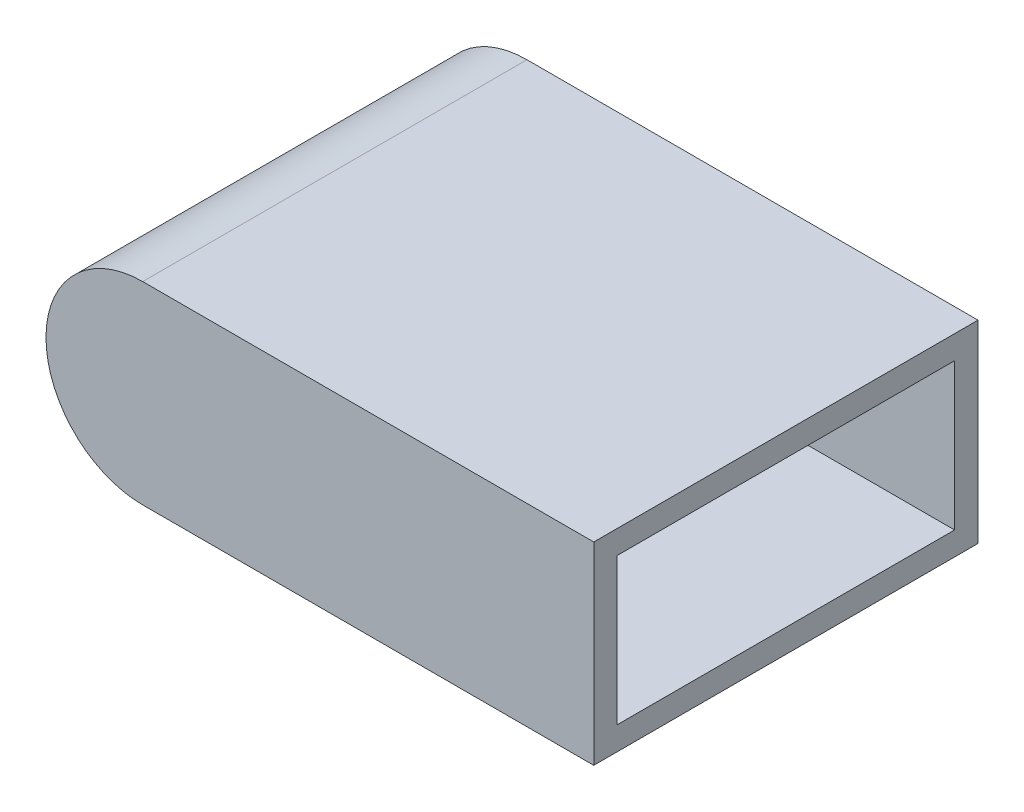
ISO-10303-21;
HEADER;
FILE_DESCRIPTION(('STEP AP214'),'2;1');
FILE_NAME('part.step','',(''),(''),'','','');
FILE_SCHEMA(('AUTOMOTIVE_DESIGN { 1 0 10303 214 1 1 1 1 }'));
ENDSEC;
DATA;
#1=APPLICATION_CONTEXT('core data for automotive mechanical design processes');
#2=APPLICATION_PROTOCOL_DEFINITION('international standard','automotive_design',2000,#1);
#3=PRODUCT_CONTEXT('',#1,'mechanical');
#4=PRODUCT('Part','Part','',(#3));
#5=PRODUCT_RELATED_PRODUCT_CATEGORY('part','',(#4));
#6=PRODUCT_DEFINITION_FORMATION('','',#4);
#7=PRODUCT_DEFINITION_CONTEXT('part definition',#1,'design');
#8=PRODUCT_DEFINITION('design','',#6,#7);
#9=PRODUCT_DEFINITION_SHAPE('','',#8);
#10=(LENGTH_UNIT() NAMED_UNIT(*) SI_UNIT(.MILLI.,.METRE.));
#11=(NAMED_UNIT(*) PLANE_ANGLE_UNIT() SI_UNIT($,.RADIAN.));
#12=(NAMED_UNIT(*) SI_UNIT($,.STERADIAN.) SOLID_ANGLE_UNIT());
#13=UNCERTAINTY_MEASURE_WITH_UNIT(LENGTH_MEASURE(1.E-05),#10,'distance_accuracy_value','');
#14=(GEOMETRIC_REPRESENTATION_CONTEXT(3) GLOBAL_UNCERTAINTY_ASSIGNED_CONTEXT((#13)) GLOBAL_UNIT_ASSIGNED_CONTEXT((#10,
#11,#12)) REPRESENTATION_CONTEXT('',''));
#15=CARTESIAN_POINT('',(0.,0.,0.));
#16=DIRECTION('',(0.,0.,1.));
#17=DIRECTION('',(1.,0.,0.));
#18=AXIS2_PLACEMENT_3D('',#15,#16,#17);
#19=CARTESIAN_POINT('',(18.2408360128618,22.3,22.15));
#20=DIRECTION('',(0.,0.,-1.));
#21=DIRECTION('',(-1.,0.,0.));
#22=AXIS2_PLACEMENT_3D('',#19,#20,#21);
#23=PLANE('',#22);
#24=DIRECTION('',(1.,0.,0.));
#25=VECTOR('',#24,1.);
#26=CARTESIAN_POINT('',(18.2408360128618,0.,22.15));
#27=LINE('',#26,#25);
#28=CARTESIAN_POINT('',(-33.7591639871383,0.,22.15));
#29=VERTEX_POINT('',#28);
#30=CARTESIAN_POINT('',(18.2408360128618,0.,22.15));
#31=VERTEX_POINT('',#30);
#32=EDGE_CURVE('E157',#29,#31,#27,.T.);
#33=ORIENTED_EDGE('',*,*,#32,.T.);
#34=DIRECTION('',(0.,-1.,0.));
#35=VECTOR('',#34,1.);
#36=CARTESIAN_POINT('',(18.2408360128618,22.3,22.15));
#37=LINE('',#36,#35);
#38=CARTESIAN_POINT('',(18.2408360128618,22.3,22.15));
#39=VERTEX_POINT('',#38);
#40=EDGE_CURVE('E11',#39,#31,#37,.T.);
#41=ORIENTED_EDGE('',*,*,#40,.F.);
#42=DIRECTION('',(1.,0.,0.));
#43=VECTOR('',#42,1.);
#44=CARTESIAN_POINT('',(18.2408360128618,22.3,22.15));
#45=LINE('',#44,#43);
#46=CARTESIAN_POINT('',(-33.7591639871383,22.3,22.15));
#47=VERTEX_POINT('',#46);
#48=EDGE_CURVE('E83',#47,#39,#45,.T.);
#49=ORIENTED_EDGE('',*,*,#48,.F.);
#50=CARTESIAN_POINT('',(-33.7591639871383,11.15,22.15));
#51=DIRECTION('',(0.,0.,1.));
#52=DIRECTION('',(1.,0.,0.));
#53=AXIS2_PLACEMENT_3D('',#50,#51,#52);
#54=CIRCLE('',#53,11.15);
#55=EDGE_CURVE('E117',#47,#29,#54,.T.);
#56=ORIENTED_EDGE('',*,*,#55,.T.);
#57=EDGE_LOOP('',(#33,#41,#49,#56));
#58=FACE_BOUND('',#57,.T.);
#59=ADVANCED_FACE('F33',(#58),#23,.F.);
#60=CARTESIAN_POINT('',(18.2408360128617,22.3,-22.15));
#61=DIRECTION('',(-1.,0.,0.));
#62=DIRECTION('',(0.,0.,1.));
#63=AXIS2_PLACEMENT_3D('',#60,#61,#62);
#64=PLANE('',#63);
#65=DIRECTION('',(0.,0.,1.));
#66=VECTOR('',#65,1.);
#67=CARTESIAN_POINT('',(18.2408360128618,19.6,19.45));
#68=LINE('',#67,#66);
#69=CARTESIAN_POINT('',(18.2408360128617,19.6,-19.45));
#70=VERTEX_POINT('',#69);
#71=CARTESIAN_POINT('',(18.2408360128618,19.6,19.45));
#72=VERTEX_POINT('',#71);
#73=EDGE_CURVE('E138',#70,#72,#68,.T.);
#74=ORIENTED_EDGE('',*,*,#73,.F.);
#75=DIRECTION('',(0.,1.,0.));
#76=VECTOR('',#75,1.);
#77=CARTESIAN_POINT('',(18.2408360128617,2.7,-19.45));
#78=LINE('',#77,#76);
#79=CARTESIAN_POINT('',(18.2408360128617,2.7,-19.45));
#80=VERTEX_POINT('',#79);
#81=EDGE_CURVE('E47',#80,#70,#78,.T.);
#82=ORIENTED_EDGE('',*,*,#81,.F.);
#83=DIRECTION('',(0.,0.,-1.));
#84=VECTOR('',#83,1.);
#85=CARTESIAN_POINT('',(18.2408360128618,2.7,19.45));
#86=LINE('',#85,#84);
#87=CARTESIAN_POINT('',(18.2408360128618,2.7,19.45));
#88=VERTEX_POINT('',#87);
#89=EDGE_CURVE('E128',#88,#80,#86,.T.);
#90=ORIENTED_EDGE('',*,*,#89,.F.);
#91=DIRECTION('',(0.,-1.,0.));
#92=VECTOR('',#91,1.);
#93=CARTESIAN_POINT('',(18.2408360128618,2.7,19.45));
#94=LINE('',#93,#92);
#95=EDGE_CURVE('E132',#72,#88,#94,.T.);
#96=ORIENTED_EDGE('',*,*,#95,.F.);
#97=EDGE_LOOP('',(#74,#82,#90,#96));
#98=FACE_BOUND('',#97,.T.);
#99=DIRECTION('',(0.,0.,-1.));
#100=VECTOR('',#99,1.);
#101=CARTESIAN_POINT('',(18.2408360128617,0.,-22.15));
#102=LINE('',#101,#100);
#103=CARTESIAN_POINT('',(18.2408360128617,0.,-22.15));
#104=VERTEX_POINT('',#103);
#105=EDGE_CURVE('E159',#31,#104,#102,.T.);
#106=ORIENTED_EDGE('',*,*,#105,.T.);
#107=DIRECTION('',(0.,-1.,0.));
#108=VECTOR('',#107,1.);
#109=CARTESIAN_POINT('',(18.2408360128617,22.3,-22.15));
#110=LINE('',#109,#108);
#111=CARTESIAN_POINT('',(18.2408360128617,22.3,-22.15));
#112=VERTEX_POINT('',#111);
#113=EDGE_CURVE('E40',#112,#104,#110,.T.);
#114=ORIENTED_EDGE('',*,*,#113,.F.);
#115=DIRECTION('',(0.,0.,-1.));
#116=VECTOR('',#115,1.);
#117=CARTESIAN_POINT('',(18.2408360128617,22.3,-22.15));
#118=LINE('',#117,#116);
#119=EDGE_CURVE('E152',#39,#112,#118,.T.);
#120=ORIENTED_EDGE('',*,*,#119,.F.);
#121=ORIENTED_EDGE('',*,*,#40,.T.);
#122=EDGE_LOOP('',(#106,#114,#120,#121));
#123=FACE_BOUND('',#122,.T.);
#124=ADVANCED_FACE('F181',(#98,#123),#64,.F.);
#125=CARTESIAN_POINT('',(18.2408360128617,22.3,-22.15));
#126=DIRECTION('',(0.,0.,1.));
#127=DIRECTION('',(1.,0.,0.));
#128=AXIS2_PLACEMENT_3D('',#125,#126,#127);
#129=PLANE('',#128);
#130=DIRECTION('',(-1.,0.,0.));
#131=VECTOR('',#130,1.);
#132=CARTESIAN_POINT('',(18.2408360128617,0.,-22.15));
#133=LINE('',#132,#131);
#134=CARTESIAN_POINT('',(-33.7591639871383,0.,-22.15));
#135=VERTEX_POINT('',#134);
#136=EDGE_CURVE('E75',#104,#135,#133,.T.);
#137=ORIENTED_EDGE('',*,*,#136,.T.);
#138=CARTESIAN_POINT('',(-33.7591639871383,11.15,-22.15));
#139=DIRECTION('',(0.,0.,1.));
#140=DIRECTION('',(1.,0.,0.));
#141=AXIS2_PLACEMENT_3D('',#138,#139,#140);
#142=CIRCLE('',#141,11.15);
#143=CARTESIAN_POINT('',(-33.7591639871383,22.3,-22.15));
#144=VERTEX_POINT('',#143);
#145=EDGE_CURVE('E139',#144,#135,#142,.T.);
#146=ORIENTED_EDGE('',*,*,#145,.F.);
#147=DIRECTION('',(-1.,0.,0.));
#148=VECTOR('',#147,1.);
#149=CARTESIAN_POINT('',(18.2408360128617,22.3,-22.15));
#150=LINE('',#149,#148);
#151=EDGE_CURVE('E56',#112,#144,#150,.T.);
#152=ORIENTED_EDGE('',*,*,#151,.F.);
#153=ORIENTED_EDGE('',*,*,#113,.T.);
#154=EDGE_LOOP('',(#137,#146,#152,#153));
#155=FACE_BOUND('',#154,.T.);
#156=ADVANCED_FACE('F162',(#155),#129,.F.);
#157=CARTESIAN_POINT('',(0.,22.3,0.));
#158=DIRECTION('',(0.,-1.,0.));
#159=DIRECTION('',(0.,0.,-1.));
#160=AXIS2_PLACEMENT_3D('',#157,#158,#159);
#161=PLANE('',#160);
#162=DIRECTION('',(0.,0.,1.));
#163=VECTOR('',#162,1.);
#164=CARTESIAN_POINT('',(-33.7591639871383,22.3,-22.15));
#165=LINE('',#164,#163);
#166=EDGE_CURVE('E149',#144,#47,#165,.T.);
#167=ORIENTED_EDGE('',*,*,#166,.T.);
#168=ORIENTED_EDGE('',*,*,#48,.T.);
#169=ORIENTED_EDGE('',*,*,#119,.T.);
#170=ORIENTED_EDGE('',*,*,#151,.T.);
#171=EDGE_LOOP('',(#167,#168,#169,#170));
#172=FACE_BOUND('',#171,.T.);
#173=ADVANCED_FACE('F196',(#172),#161,.F.);
#174=CARTESIAN_POINT('',(0.,0.,0.));
#175=DIRECTION('',(0.,-1.,0.));
#176=DIRECTION('',(0.,0.,-1.));
#177=AXIS2_PLACEMENT_3D('',#174,#175,#176);
#178=PLANE('',#177);
#179=DIRECTION('',(0.,0.,1.));
#180=VECTOR('',#179,1.);
#181=CARTESIAN_POINT('',(-33.7591639871383,0.,-22.15));
#182=LINE('',#181,#180);
#183=EDGE_CURVE('E145',#135,#29,#182,.T.);
#184=ORIENTED_EDGE('',*,*,#183,.F.);
#185=ORIENTED_EDGE('',*,*,#136,.F.);
#186=ORIENTED_EDGE('',*,*,#105,.F.);
#187=ORIENTED_EDGE('',*,*,#32,.F.);
#188=EDGE_LOOP('',(#184,#185,#186,#187));
#189=FACE_BOUND('',#188,.T.);
#190=ADVANCED_FACE('F167',(#189),#178,.T.);
#191=CARTESIAN_POINT('',(-33.7591639871383,2.7,-19.45));
#192=DIRECTION('',(0.,0.,-1.));
#193=DIRECTION('',(0.,1.,0.));
#194=AXIS2_PLACEMENT_3D('',#191,#192,#193);
#195=PLANE('',#194);
#196=ORIENTED_EDGE('',*,*,#81,.T.);
#197=DIRECTION('',(1.,0.,0.));
#198=VECTOR('',#197,1.);
#199=CARTESIAN_POINT('',(-33.7591639871383,19.6,-19.45));
#200=LINE('',#199,#198);
#201=CARTESIAN_POINT('',(-33.7591639871383,19.5999950016852,-19.45));
#202=VERTEX_POINT('',#201);
#203=EDGE_CURVE('E120',#202,#70,#200,.T.);
#204=ORIENTED_EDGE('',*,*,#203,.F.);
#205=CARTESIAN_POINT('',(-33.7591639871383,11.15,-19.45));
#206=DIRECTION('',(0.,0.,-1.));
#207=DIRECTION('',(-1.,0.,0.));
#208=AXIS2_PLACEMENT_3D('',#205,#206,#207);
#209=CIRCLE('',#208,8.44999500168524);
#210=CARTESIAN_POINT('',(-33.7591639871383,2.70000499831476,-19.45));
#211=VERTEX_POINT('',#210);
#212=EDGE_CURVE('E109',#211,#202,#209,.T.);
#213=ORIENTED_EDGE('',*,*,#212,.F.);
#214=DIRECTION('',(1.,0.,0.));
#215=VECTOR('',#214,1.);
#216=CARTESIAN_POINT('',(-33.7591639871383,2.7,-19.45));
#217=LINE('',#216,#215);
#218=EDGE_CURVE('E143',#211,#80,#217,.T.);
#219=ORIENTED_EDGE('',*,*,#218,.T.);
#220=EDGE_LOOP('',(#196,#204,#213,#219));
#221=FACE_BOUND('',#220,.T.);
#222=ADVANCED_FACE('F121',(#221),#195,.F.);
#223=CARTESIAN_POINT('',(-33.7591639871383,2.7,19.45));
#224=DIRECTION('',(0.,-1.,0.));
#225=DIRECTION('',(0.,0.,-1.));
#226=AXIS2_PLACEMENT_3D('',#223,#224,#225);
#227=PLANE('',#226);
#228=ORIENTED_EDGE('',*,*,#89,.T.);
#229=ORIENTED_EDGE('',*,*,#218,.F.);
#230=DIRECTION('',(0.,0.,-1.));
#231=VECTOR('',#230,1.);
#232=CARTESIAN_POINT('',(-33.7591639871383,2.7,19.45));
#233=LINE('',#232,#231);
#234=CARTESIAN_POINT('',(-33.7591639871383,2.70000499831476,19.45));
#235=VERTEX_POINT('',#234);
#236=EDGE_CURVE('E115',#235,#211,#233,.T.);
#237=ORIENTED_EDGE('',*,*,#236,.F.);
#238=DIRECTION('',(1.,0.,0.));
#239=VECTOR('',#238,1.);
#240=CARTESIAN_POINT('',(-33.7591639871383,2.7,19.45));
#241=LINE('',#240,#239);
#242=EDGE_CURVE('E146',#235,#88,#241,.T.);
#243=ORIENTED_EDGE('',*,*,#242,.T.);
#244=EDGE_LOOP('',(#228,#229,#237,#243));
#245=FACE_BOUND('',#244,.T.);
#246=ADVANCED_FACE('F179',(#245),#227,.F.);
#247=CARTESIAN_POINT('',(-33.7591639871383,2.7,19.45));
#248=DIRECTION('',(0.,0.,1.));
#249=DIRECTION('',(1.,0.,0.));
#250=AXIS2_PLACEMENT_3D('',#247,#248,#249);
#251=PLANE('',#250);
#252=ORIENTED_EDGE('',*,*,#95,.T.);
#253=ORIENTED_EDGE('',*,*,#242,.F.);
#254=CARTESIAN_POINT('',(-33.7591639871383,11.15,19.45));
#255=DIRECTION('',(0.,0.,-1.));
#256=DIRECTION('',(-1.,0.,0.));
#257=AXIS2_PLACEMENT_3D('',#254,#255,#256);
#258=CIRCLE('',#257,8.44999500168524);
#259=CARTESIAN_POINT('',(-33.7591639871383,19.6,19.45));
#260=VERTEX_POINT('',#259);
#261=EDGE_CURVE('E118',#235,#260,#258,.T.);
#262=ORIENTED_EDGE('',*,*,#261,.T.);
#263=DIRECTION('',(1.,0.,0.));
#264=VECTOR('',#263,1.);
#265=CARTESIAN_POINT('',(-33.7591639871383,19.6,19.45));
#266=LINE('',#265,#264);
#267=EDGE_CURVE('E125',#260,#72,#266,.T.);
#268=ORIENTED_EDGE('',*,*,#267,.T.);
#269=EDGE_LOOP('',(#252,#253,#262,#268));
#270=FACE_BOUND('',#269,.T.);
#271=ADVANCED_FACE('F175',(#270),#251,.F.);
#272=CARTESIAN_POINT('',(-33.7591639871383,19.6,19.45));
#273=DIRECTION('',(0.,1.,0.));
#274=DIRECTION('',(0.,0.,1.));
#275=AXIS2_PLACEMENT_3D('',#272,#273,#274);
#276=PLANE('',#275);
#277=ORIENTED_EDGE('',*,*,#73,.T.);
#278=ORIENTED_EDGE('',*,*,#267,.F.);
#279=DIRECTION('',(0.,0.,1.));
#280=VECTOR('',#279,1.);
#281=CARTESIAN_POINT('',(-33.7591639871383,19.6,19.45));
#282=LINE('',#281,#280);
#283=EDGE_CURVE('E112',#202,#260,#282,.T.);
#284=ORIENTED_EDGE('',*,*,#283,.F.);
#285=ORIENTED_EDGE('',*,*,#203,.T.);
#286=EDGE_LOOP('',(#277,#278,#284,#285));
#287=FACE_BOUND('',#286,.T.);
#288=ADVANCED_FACE('F127',(#287),#276,.F.);
#289=CARTESIAN_POINT('',(-33.7591639871383,11.15,-22.15));
#290=DIRECTION('',(0.,0.,1.));
#291=DIRECTION('',(1.,0.,0.));
#292=AXIS2_PLACEMENT_3D('',#289,#290,#291);
#293=CYLINDRICAL_SURFACE('',#292,11.15);
#294=ORIENTED_EDGE('',*,*,#55,.F.);
#295=ORIENTED_EDGE('',*,*,#166,.F.);
#296=ORIENTED_EDGE('',*,*,#145,.T.);
#297=ORIENTED_EDGE('',*,*,#183,.T.);
#298=EDGE_LOOP('',(#294,#295,#296,#297));
#299=FACE_BOUND('',#298,.T.);
#300=ADVANCED_FACE('F171',(#299),#293,.T.);
#301=CARTESIAN_POINT('',(-33.7591639871383,11.15,-19.45));
#302=DIRECTION('',(0.,0.,1.));
#303=DIRECTION('',(1.,0.,0.));
#304=AXIS2_PLACEMENT_3D('',#301,#302,#303);
#305=CYLINDRICAL_SURFACE('',#304,8.44999500168524);
#306=ORIENTED_EDGE('',*,*,#261,.F.);
#307=ORIENTED_EDGE('',*,*,#236,.T.);
#308=ORIENTED_EDGE('',*,*,#212,.T.);
#309=ORIENTED_EDGE('',*,*,#283,.T.);
#310=EDGE_LOOP('',(#306,#307,#308,#309));
#311=FACE_BOUND('',#310,.T.);
#312=ADVANCED_FACE('F110',(#311),#305,.F.);
#313=CLOSED_SHELL('',(#59,#124,#156,#173,#190,#222,#246,#271,#288,#300,#312));
#314=MANIFOLD_SOLID_BREP('B2',#313);
#315=ADVANCED_BREP_SHAPE_REPRESENTATION('',(#18,#314),#14);
#316=SHAPE_DEFINITION_REPRESENTATION(#9,#315);
ENDSEC;
END-ISO-10303-21;
